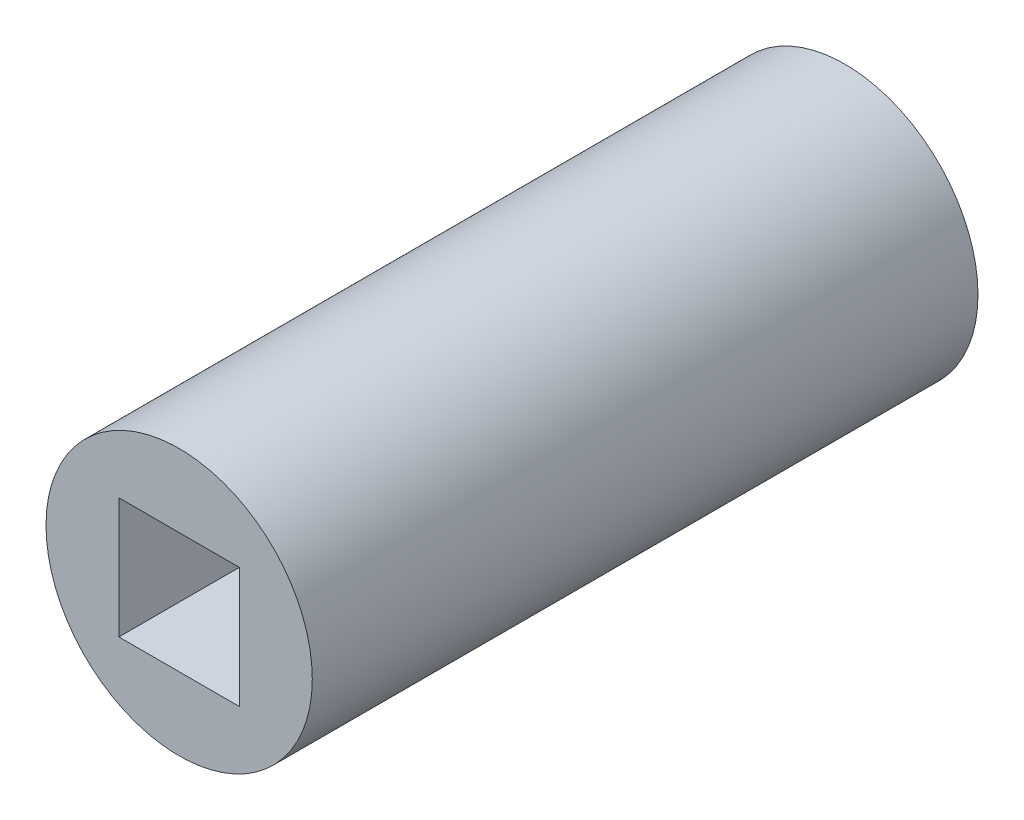
ISO-10303-21;
HEADER;
FILE_DESCRIPTION(('STEP AP214'),'2;1');
FILE_NAME('part.step','',(''),(''),'','','');
FILE_SCHEMA(('AUTOMOTIVE_DESIGN { 1 0 10303 214 1 1 1 1 }'));
ENDSEC;
DATA;
#1=APPLICATION_CONTEXT('core data for automotive mechanical design processes');
#2=APPLICATION_PROTOCOL_DEFINITION('international standard','automotive_design',2000,#1);
#3=PRODUCT_CONTEXT('',#1,'mechanical');
#4=PRODUCT('Part','Part','',(#3));
#5=PRODUCT_RELATED_PRODUCT_CATEGORY('part','',(#4));
#6=PRODUCT_DEFINITION_FORMATION('','',#4);
#7=PRODUCT_DEFINITION_CONTEXT('part definition',#1,'design');
#8=PRODUCT_DEFINITION('design','',#6,#7);
#9=PRODUCT_DEFINITION_SHAPE('','',#8);
#10=(LENGTH_UNIT() NAMED_UNIT(*) SI_UNIT(.MILLI.,.METRE.));
#11=(NAMED_UNIT(*) PLANE_ANGLE_UNIT() SI_UNIT($,.RADIAN.));
#12=(NAMED_UNIT(*) SI_UNIT($,.STERADIAN.) SOLID_ANGLE_UNIT());
#13=UNCERTAINTY_MEASURE_WITH_UNIT(LENGTH_MEASURE(1.E-05),#10,'distance_accuracy_value','');
#14=(GEOMETRIC_REPRESENTATION_CONTEXT(3) GLOBAL_UNCERTAINTY_ASSIGNED_CONTEXT((#13)) GLOBAL_UNIT_ASSIGNED_CONTEXT((#10,
#11,#12)) REPRESENTATION_CONTEXT('',''));
#15=CARTESIAN_POINT('',(0.,0.,0.));
#16=DIRECTION('',(0.,0.,1.));
#17=DIRECTION('',(1.,0.,0.));
#18=AXIS2_PLACEMENT_3D('',#15,#16,#17);
#19=CARTESIAN_POINT('',(0.,0.,0.));
#20=DIRECTION('',(0.,0.,-1.));
#21=DIRECTION('',(-1.,0.,0.));
#22=AXIS2_PLACEMENT_3D('',#19,#20,#21);
#23=PLANE('',#22);
#24=CARTESIAN_POINT('',(0.,0.,0.));
#25=DIRECTION('',(0.,0.,1.));
#26=DIRECTION('',(1.,0.,0.));
#27=AXIS2_PLACEMENT_3D('',#24,#25,#26);
#28=CIRCLE('',#27,3.5);
#29=CARTESIAN_POINT('',(3.5,0.,0.));
#30=VERTEX_POINT('',#29);
#31=EDGE_CURVE('E11',#30,#30,#28,.T.);
#32=ORIENTED_EDGE('',*,*,#31,.F.);
#33=EDGE_LOOP('',(#32));
#34=FACE_BOUND('',#33,.T.);
#35=DIRECTION('',(-1.,0.,0.));
#36=VECTOR('',#35,1.);
#37=CARTESIAN_POINT('',(-2.,1.5,0.));
#38=LINE('',#37,#36);
#39=CARTESIAN_POINT('',(2.,1.5,0.));
#40=VERTEX_POINT('',#39);
#41=CARTESIAN_POINT('',(-2.,1.5,0.));
#42=VERTEX_POINT('',#41);
#43=EDGE_CURVE('E137',#40,#42,#38,.T.);
#44=ORIENTED_EDGE('',*,*,#43,.T.);
#45=CARTESIAN_POINT('',(0.,0.,0.));
#46=DIRECTION('',(0.,0.,1.));
#47=DIRECTION('',(1.,0.,0.));
#48=AXIS2_PLACEMENT_3D('',#45,#46,#47);
#49=CIRCLE('',#48,2.5);
#50=EDGE_CURVE('E60',#42,#40,#49,.T.);
#51=ORIENTED_EDGE('',*,*,#50,.T.);
#52=EDGE_LOOP('',(#44,#51));
#53=FACE_BOUND('',#52,.T.);
#54=ADVANCED_FACE('F37',(#34,#53),#23,.T.);
#55=CARTESIAN_POINT('',(0.,0.,10.));
#56=DIRECTION('',(0.,0.,-1.));
#57=DIRECTION('',(-1.,0.,0.));
#58=AXIS2_PLACEMENT_3D('',#55,#56,#57);
#59=CYLINDRICAL_SURFACE('',#58,3.5);
#60=ORIENTED_EDGE('',*,*,#31,.T.);
#61=EDGE_LOOP('',(#60));
#62=FACE_BOUND('',#61,.T.);
#63=CARTESIAN_POINT('',(0.,0.,17.5));
#64=DIRECTION('',(0.,0.,1.));
#65=DIRECTION('',(1.,0.,0.));
#66=AXIS2_PLACEMENT_3D('',#63,#64,#65);
#67=CIRCLE('',#66,3.5);
#68=CARTESIAN_POINT('',(3.5,0.,17.5));
#69=VERTEX_POINT('',#68);
#70=EDGE_CURVE('E127',#69,#69,#67,.T.);
#71=ORIENTED_EDGE('',*,*,#70,.F.);
#72=EDGE_LOOP('',(#71));
#73=FACE_BOUND('',#72,.T.);
#74=ADVANCED_FACE('F39',(#62,#73),#59,.T.);
#75=CARTESIAN_POINT('',(0.,0.,10.));
#76=DIRECTION('',(0.,0.,-1.));
#77=DIRECTION('',(-1.,0.,0.));
#78=AXIS2_PLACEMENT_3D('',#75,#76,#77);
#79=CYLINDRICAL_SURFACE('',#78,2.5);
#80=ORIENTED_EDGE('',*,*,#50,.F.);
#81=DIRECTION('',(0.,0.,-1.));
#82=VECTOR('',#81,1.);
#83=CARTESIAN_POINT('',(-2.,1.5,10.));
#84=LINE('',#83,#82);
#85=CARTESIAN_POINT('',(-2.,1.5,10.));
#86=VERTEX_POINT('',#85);
#87=EDGE_CURVE('E140',#86,#42,#84,.T.);
#88=ORIENTED_EDGE('',*,*,#87,.F.);
#89=CARTESIAN_POINT('',(0.,0.,10.));
#90=DIRECTION('',(0.,0.,1.));
#91=DIRECTION('',(1.,0.,0.));
#92=AXIS2_PLACEMENT_3D('',#89,#90,#91);
#93=CIRCLE('',#92,2.5);
#94=CARTESIAN_POINT('',(2.,1.5,10.));
#95=VERTEX_POINT('',#94);
#96=EDGE_CURVE('E133',#86,#95,#93,.T.);
#97=ORIENTED_EDGE('',*,*,#96,.T.);
#98=DIRECTION('',(0.,0.,-1.));
#99=VECTOR('',#98,1.);
#100=CARTESIAN_POINT('',(2.,1.5,10.));
#101=LINE('',#100,#99);
#102=EDGE_CURVE('E45',#95,#40,#101,.T.);
#103=ORIENTED_EDGE('',*,*,#102,.T.);
#104=EDGE_LOOP('',(#80,#88,#97,#103));
#105=FACE_BOUND('',#104,.T.);
#106=ADVANCED_FACE('F145',(#105),#79,.F.);
#107=CARTESIAN_POINT('',(-2.,1.5,10.));
#108=DIRECTION('',(0.,-1.,0.));
#109=DIRECTION('',(0.,0.,-1.));
#110=AXIS2_PLACEMENT_3D('',#107,#108,#109);
#111=PLANE('',#110);
#112=ORIENTED_EDGE('',*,*,#43,.F.);
#113=ORIENTED_EDGE('',*,*,#102,.F.);
#114=DIRECTION('',(-1.,0.,0.));
#115=VECTOR('',#114,1.);
#116=CARTESIAN_POINT('',(-2.,1.5,10.));
#117=LINE('',#116,#115);
#118=EDGE_CURVE('E136',#95,#86,#117,.T.);
#119=ORIENTED_EDGE('',*,*,#118,.T.);
#120=ORIENTED_EDGE('',*,*,#87,.T.);
#121=EDGE_LOOP('',(#112,#113,#119,#120));
#122=FACE_BOUND('',#121,.T.);
#123=ADVANCED_FACE('F148',(#122),#111,.T.);
#124=CARTESIAN_POINT('',(0.,0.,10.));
#125=DIRECTION('',(0.,0.,1.));
#126=DIRECTION('',(1.,0.,0.));
#127=AXIS2_PLACEMENT_3D('',#124,#125,#126);
#128=PLANE('',#127);
#129=ORIENTED_EDGE('',*,*,#96,.F.);
#130=ORIENTED_EDGE('',*,*,#118,.F.);
#131=EDGE_LOOP('',(#129,#130));
#132=FACE_BOUND('',#131,.T.);
#133=ADVANCED_FACE('F150',(#132),#128,.F.);
#134=CARTESIAN_POINT('',(0.,0.,17.5));
#135=DIRECTION('',(0.,0.,1.));
#136=DIRECTION('',(1.,0.,0.));
#137=AXIS2_PLACEMENT_3D('',#134,#135,#136);
#138=PLANE('',#137);
#139=DIRECTION('',(0.,1.,0.));
#140=VECTOR('',#139,1.);
#141=CARTESIAN_POINT('',(1.583798025,-1.583784525,17.5));
#142=LINE('',#141,#140);
#143=CARTESIAN_POINT('',(1.583798025,-1.583784525,17.5));
#144=VERTEX_POINT('',#143);
#145=CARTESIAN_POINT('',(1.583798025,1.583784525,17.5));
#146=VERTEX_POINT('',#145);
#147=EDGE_CURVE('E52',#144,#146,#142,.T.);
#148=ORIENTED_EDGE('',*,*,#147,.F.);
#149=DIRECTION('',(1.,0.,0.));
#150=VECTOR('',#149,1.);
#151=CARTESIAN_POINT('',(-1.583798025,-1.583784525,17.5));
#152=LINE('',#151,#150);
#153=CARTESIAN_POINT('',(-1.583798025,-1.583784525,17.5));
#154=VERTEX_POINT('',#153);
#155=EDGE_CURVE('E112',#154,#144,#152,.T.);
#156=ORIENTED_EDGE('',*,*,#155,.F.);
#157=DIRECTION('',(0.,-1.,0.));
#158=VECTOR('',#157,1.);
#159=CARTESIAN_POINT('',(-1.583798025,-1.583784525,17.5));
#160=LINE('',#159,#158);
#161=CARTESIAN_POINT('',(-1.583798025,1.583784525,17.5));
#162=VERTEX_POINT('',#161);
#163=EDGE_CURVE('E115',#162,#154,#160,.T.);
#164=ORIENTED_EDGE('',*,*,#163,.F.);
#165=DIRECTION('',(-1.,0.,0.));
#166=VECTOR('',#165,1.);
#167=CARTESIAN_POINT('',(-1.583798025,1.583784525,17.5));
#168=LINE('',#167,#166);
#169=EDGE_CURVE('E121',#146,#162,#168,.T.);
#170=ORIENTED_EDGE('',*,*,#169,.F.);
#171=EDGE_LOOP('',(#148,#156,#164,#170));
#172=FACE_BOUND('',#171,.T.);
#173=ORIENTED_EDGE('',*,*,#70,.T.);
#174=EDGE_LOOP('',(#173));
#175=FACE_BOUND('',#174,.T.);
#176=ADVANCED_FACE('F152',(#172,#175),#138,.T.);
#177=CARTESIAN_POINT('',(1.583798025,-1.583784525,12.5));
#178=DIRECTION('',(1.,0.,0.));
#179=DIRECTION('',(0.,0.,-1.));
#180=AXIS2_PLACEMENT_3D('',#177,#178,#179);
#181=PLANE('',#180);
#182=ORIENTED_EDGE('',*,*,#147,.T.);
#183=DIRECTION('',(0.,0.,1.));
#184=VECTOR('',#183,1.);
#185=CARTESIAN_POINT('',(1.583798025,1.583784525,12.5));
#186=LINE('',#185,#184);
#187=CARTESIAN_POINT('',(1.583798025,1.583784525,12.5));
#188=VERTEX_POINT('',#187);
#189=EDGE_CURVE('E90',#188,#146,#186,.T.);
#190=ORIENTED_EDGE('',*,*,#189,.F.);
#191=DIRECTION('',(0.,1.,0.));
#192=VECTOR('',#191,1.);
#193=CARTESIAN_POINT('',(1.583798025,-1.583784525,12.5));
#194=LINE('',#193,#192);
#195=CARTESIAN_POINT('',(1.583798025,-1.583784525,12.5));
#196=VERTEX_POINT('',#195);
#197=EDGE_CURVE('E94',#196,#188,#194,.T.);
#198=ORIENTED_EDGE('',*,*,#197,.F.);
#199=DIRECTION('',(0.,0.,1.));
#200=VECTOR('',#199,1.);
#201=CARTESIAN_POINT('',(1.583798025,-1.583784525,12.5));
#202=LINE('',#201,#200);
#203=EDGE_CURVE('E125',#196,#144,#202,.T.);
#204=ORIENTED_EDGE('',*,*,#203,.T.);
#205=EDGE_LOOP('',(#182,#190,#198,#204));
#206=FACE_BOUND('',#205,.T.);
#207=ADVANCED_FACE('F92',(#206),#181,.F.);
#208=CARTESIAN_POINT('',(-1.583798025,-1.583784525,12.5));
#209=DIRECTION('',(0.,-1.,0.));
#210=DIRECTION('',(0.,0.,-1.));
#211=AXIS2_PLACEMENT_3D('',#208,#209,#210);
#212=PLANE('',#211);
#213=ORIENTED_EDGE('',*,*,#155,.T.);
#214=ORIENTED_EDGE('',*,*,#203,.F.);
#215=DIRECTION('',(1.,0.,0.));
#216=VECTOR('',#215,1.);
#217=CARTESIAN_POINT('',(-1.583798025,-1.583784525,12.5));
#218=LINE('',#217,#216);
#219=CARTESIAN_POINT('',(-1.583798025,-1.583784525,12.5));
#220=VERTEX_POINT('',#219);
#221=EDGE_CURVE('E100',#220,#196,#218,.T.);
#222=ORIENTED_EDGE('',*,*,#221,.F.);
#223=DIRECTION('',(0.,0.,1.));
#224=VECTOR('',#223,1.);
#225=CARTESIAN_POINT('',(-1.583798025,-1.583784525,12.5));
#226=LINE('',#225,#224);
#227=EDGE_CURVE('E128',#220,#154,#226,.T.);
#228=ORIENTED_EDGE('',*,*,#227,.T.);
#229=EDGE_LOOP('',(#213,#214,#222,#228));
#230=FACE_BOUND('',#229,.T.);
#231=ADVANCED_FACE('F201',(#230),#212,.F.);
#232=CARTESIAN_POINT('',(-1.583798025,-1.583784525,12.5));
#233=DIRECTION('',(-1.,0.,0.));
#234=DIRECTION('',(0.,0.,1.));
#235=AXIS2_PLACEMENT_3D('',#232,#233,#234);
#236=PLANE('',#235);
#237=ORIENTED_EDGE('',*,*,#163,.T.);
#238=ORIENTED_EDGE('',*,*,#227,.F.);
#239=DIRECTION('',(0.,-1.,0.));
#240=VECTOR('',#239,1.);
#241=CARTESIAN_POINT('',(-1.583798025,-1.583784525,12.5));
#242=LINE('',#241,#240);
#243=CARTESIAN_POINT('',(-1.583798025,1.583784525,12.5));
#244=VERTEX_POINT('',#243);
#245=EDGE_CURVE('E108',#244,#220,#242,.T.);
#246=ORIENTED_EDGE('',*,*,#245,.F.);
#247=DIRECTION('',(0.,0.,1.));
#248=VECTOR('',#247,1.);
#249=CARTESIAN_POINT('',(-1.583798025,1.583784525,12.5));
#250=LINE('',#249,#248);
#251=EDGE_CURVE('E99',#244,#162,#250,.T.);
#252=ORIENTED_EDGE('',*,*,#251,.T.);
#253=EDGE_LOOP('',(#237,#238,#246,#252));
#254=FACE_BOUND('',#253,.T.);
#255=ADVANCED_FACE('F211',(#254),#236,.F.);
#256=CARTESIAN_POINT('',(-1.583798025,1.583784525,12.5));
#257=DIRECTION('',(0.,1.,0.));
#258=DIRECTION('',(0.,0.,1.));
#259=AXIS2_PLACEMENT_3D('',#256,#257,#258);
#260=PLANE('',#259);
#261=ORIENTED_EDGE('',*,*,#169,.T.);
#262=ORIENTED_EDGE('',*,*,#251,.F.);
#263=DIRECTION('',(-1.,0.,0.));
#264=VECTOR('',#263,1.);
#265=CARTESIAN_POINT('',(-1.583798025,1.583784525,12.5));
#266=LINE('',#265,#264);
#267=EDGE_CURVE('E103',#188,#244,#266,.T.);
#268=ORIENTED_EDGE('',*,*,#267,.F.);
#269=ORIENTED_EDGE('',*,*,#189,.T.);
#270=EDGE_LOOP('',(#261,#262,#268,#269));
#271=FACE_BOUND('',#270,.T.);
#272=ADVANCED_FACE('F104',(#271),#260,.F.);
#273=CARTESIAN_POINT('',(0.,0.,12.5));
#274=DIRECTION('',(0.,0.,-1.));
#275=DIRECTION('',(-1.,0.,0.));
#276=AXIS2_PLACEMENT_3D('',#273,#274,#275);
#277=PLANE('',#276);
#278=ORIENTED_EDGE('',*,*,#197,.T.);
#279=ORIENTED_EDGE('',*,*,#267,.T.);
#280=ORIENTED_EDGE('',*,*,#245,.T.);
#281=ORIENTED_EDGE('',*,*,#221,.T.);
#282=EDGE_LOOP('',(#278,#279,#280,#281));
#283=FACE_BOUND('',#282,.T.);
#284=ADVANCED_FACE('F110',(#283),#277,.F.);
#285=CLOSED_SHELL('',(#54,#74,#106,#123,#133,#176,#207,#231,#255,#272,#284));
#286=MANIFOLD_SOLID_BREP('B2',#285);
#287=ADVANCED_BREP_SHAPE_REPRESENTATION('',(#18,#286),#14);
#288=SHAPE_DEFINITION_REPRESENTATION(#9,#287);
ENDSEC;
END-ISO-10303-21;
